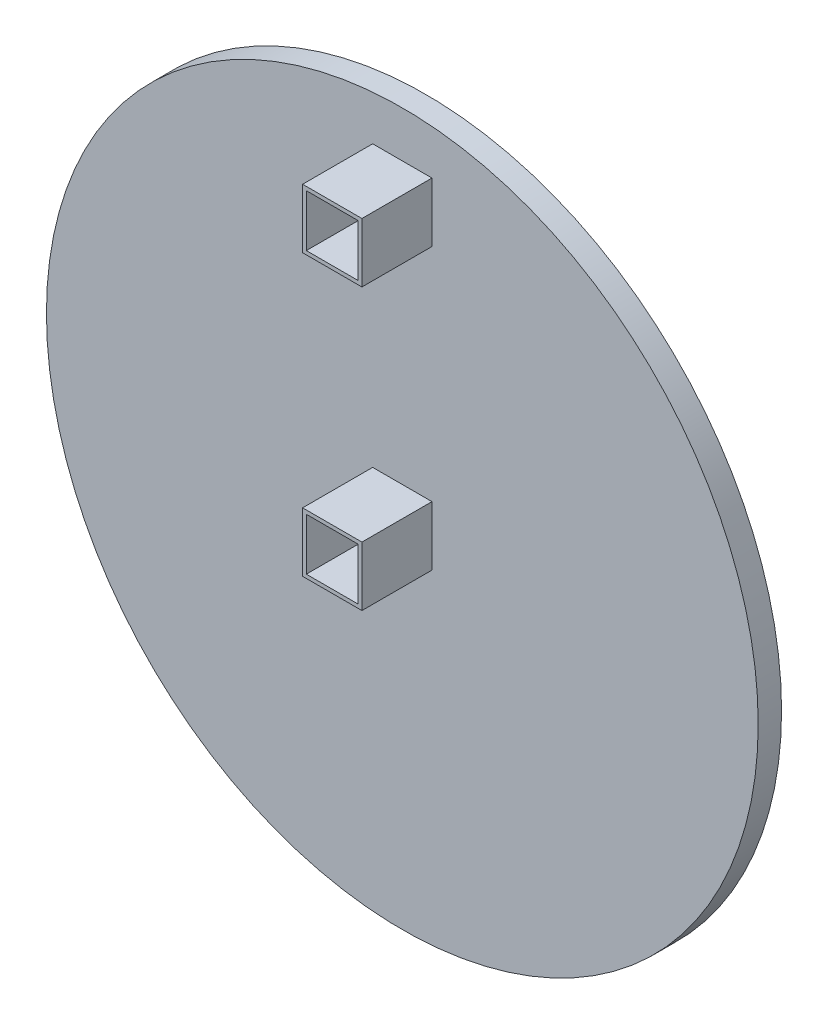
ISO-10303-21;
HEADER;
FILE_DESCRIPTION(('STEP AP214'),'2;1');
FILE_NAME('part.step','',(''),(''),'','','');
FILE_SCHEMA(('AUTOMOTIVE_DESIGN { 1 0 10303 214 1 1 1 1 }'));
ENDSEC;
DATA;
#1=APPLICATION_CONTEXT('core data for automotive mechanical design processes');
#2=APPLICATION_PROTOCOL_DEFINITION('international standard','automotive_design',2000,#1);
#3=PRODUCT_CONTEXT('',#1,'mechanical');
#4=PRODUCT('Part','Part','',(#3));
#5=PRODUCT_RELATED_PRODUCT_CATEGORY('part','',(#4));
#6=PRODUCT_DEFINITION_FORMATION('','',#4);
#7=PRODUCT_DEFINITION_CONTEXT('part definition',#1,'design');
#8=PRODUCT_DEFINITION('design','',#6,#7);
#9=PRODUCT_DEFINITION_SHAPE('','',#8);
#10=(LENGTH_UNIT() NAMED_UNIT(*) SI_UNIT(.MILLI.,.METRE.));
#11=(NAMED_UNIT(*) PLANE_ANGLE_UNIT() SI_UNIT($,.RADIAN.));
#12=(NAMED_UNIT(*) SI_UNIT($,.STERADIAN.) SOLID_ANGLE_UNIT());
#13=UNCERTAINTY_MEASURE_WITH_UNIT(LENGTH_MEASURE(1.E-05),#10,'distance_accuracy_value','');
#14=(GEOMETRIC_REPRESENTATION_CONTEXT(3) GLOBAL_UNCERTAINTY_ASSIGNED_CONTEXT((#13)) GLOBAL_UNIT_ASSIGNED_CONTEXT((#10,
#11,#12)) REPRESENTATION_CONTEXT('',''));
#15=CARTESIAN_POINT('',(0.,0.,0.));
#16=DIRECTION('',(0.,0.,1.));
#17=DIRECTION('',(1.,0.,0.));
#18=AXIS2_PLACEMENT_3D('',#15,#16,#17);
#19=CARTESIAN_POINT('',(0.,0.,10.));
#20=DIRECTION('',(0.,0.,1.));
#21=DIRECTION('',(1.,0.,0.));
#22=AXIS2_PLACEMENT_3D('',#19,#20,#21);
#23=PLANE('',#22);
#24=DIRECTION('',(-1.,0.,0.));
#25=VECTOR('',#24,1.);
#26=CARTESIAN_POINT('',(-12.7,12.7,10.));
#27=LINE('',#26,#25);
#28=CARTESIAN_POINT('',(12.7,12.7,10.));
#29=VERTEX_POINT('',#28);
#30=CARTESIAN_POINT('',(-12.7,12.7,10.));
#31=VERTEX_POINT('',#30);
#32=EDGE_CURVE('E256',#29,#31,#27,.T.);
#33=ORIENTED_EDGE('',*,*,#32,.F.);
#34=DIRECTION('',(0.,1.,0.));
#35=VECTOR('',#34,1.);
#36=CARTESIAN_POINT('',(12.7,12.7,10.));
#37=LINE('',#36,#35);
#38=CARTESIAN_POINT('',(12.7,-12.7,10.));
#39=VERTEX_POINT('',#38);
#40=EDGE_CURVE('E242',#39,#29,#37,.T.);
#41=ORIENTED_EDGE('',*,*,#40,.F.);
#42=DIRECTION('',(1.,0.,0.));
#43=VECTOR('',#42,1.);
#44=CARTESIAN_POINT('',(-12.7,-12.7,10.));
#45=LINE('',#44,#43);
#46=CARTESIAN_POINT('',(-12.7,-12.7,10.));
#47=VERTEX_POINT('',#46);
#48=EDGE_CURVE('E247',#47,#39,#45,.T.);
#49=ORIENTED_EDGE('',*,*,#48,.F.);
#50=DIRECTION('',(0.,-1.,0.));
#51=VECTOR('',#50,1.);
#52=CARTESIAN_POINT('',(-12.7,12.7,10.));
#53=LINE('',#52,#51);
#54=EDGE_CURVE('E258',#31,#47,#53,.T.);
#55=ORIENTED_EDGE('',*,*,#54,.F.);
#56=EDGE_LOOP('',(#33,#41,#49,#55));
#57=FACE_BOUND('',#56,.T.);
#58=CARTESIAN_POINT('',(0.,0.,10.));
#59=DIRECTION('',(0.,0.,1.));
#60=DIRECTION('',(1.,0.,0.));
#61=AXIS2_PLACEMENT_3D('',#58,#59,#60);
#62=CIRCLE('',#61,152.4);
#63=CARTESIAN_POINT('',(152.4,0.,10.));
#64=VERTEX_POINT('',#63);
#65=EDGE_CURVE('E11',#64,#64,#62,.T.);
#66=ORIENTED_EDGE('',*,*,#65,.T.);
#67=EDGE_LOOP('',(#66));
#68=FACE_BOUND('',#67,.T.);
#69=DIRECTION('',(-1.,0.,0.));
#70=VECTOR('',#69,1.);
#71=CARTESIAN_POINT('',(-12.7,132.7,10.));
#72=LINE('',#71,#70);
#73=CARTESIAN_POINT('',(12.7,132.7,10.));
#74=VERTEX_POINT('',#73);
#75=CARTESIAN_POINT('',(-12.7,132.7,10.));
#76=VERTEX_POINT('',#75);
#77=EDGE_CURVE('E200',#74,#76,#72,.T.);
#78=ORIENTED_EDGE('',*,*,#77,.F.);
#79=DIRECTION('',(0.,1.,0.));
#80=VECTOR('',#79,1.);
#81=CARTESIAN_POINT('',(12.7,132.7,10.));
#82=LINE('',#81,#80);
#83=CARTESIAN_POINT('',(12.7,107.3,10.));
#84=VERTEX_POINT('',#83);
#85=EDGE_CURVE('E165',#84,#74,#82,.T.);
#86=ORIENTED_EDGE('',*,*,#85,.F.);
#87=DIRECTION('',(1.,0.,0.));
#88=VECTOR('',#87,1.);
#89=CARTESIAN_POINT('',(-12.7,107.3,10.));
#90=LINE('',#89,#88);
#91=CARTESIAN_POINT('',(-12.7,107.3,10.));
#92=VERTEX_POINT('',#91);
#93=EDGE_CURVE('E191',#92,#84,#90,.T.);
#94=ORIENTED_EDGE('',*,*,#93,.F.);
#95=DIRECTION('',(0.,-1.,0.));
#96=VECTOR('',#95,1.);
#97=CARTESIAN_POINT('',(-12.7,132.7,10.));
#98=LINE('',#97,#96);
#99=EDGE_CURVE('E202',#76,#92,#98,.T.);
#100=ORIENTED_EDGE('',*,*,#99,.F.);
#101=EDGE_LOOP('',(#78,#86,#94,#100));
#102=FACE_BOUND('',#101,.T.);
#103=ADVANCED_FACE('F33',(#57,#68,#102),#23,.T.);
#104=CARTESIAN_POINT('',(0.,0.,10.));
#105=DIRECTION('',(0.,0.,-1.));
#106=DIRECTION('',(-1.,0.,0.));
#107=AXIS2_PLACEMENT_3D('',#104,#105,#106);
#108=CYLINDRICAL_SURFACE('',#107,152.4);
#109=ORIENTED_EDGE('',*,*,#65,.F.);
#110=EDGE_LOOP('',(#109));
#111=FACE_BOUND('',#110,.T.);
#112=CARTESIAN_POINT('',(0.,0.,0.));
#113=DIRECTION('',(0.,0.,1.));
#114=DIRECTION('',(1.,0.,0.));
#115=AXIS2_PLACEMENT_3D('',#112,#113,#114);
#116=CIRCLE('',#115,152.4);
#117=CARTESIAN_POINT('',(152.4,0.,0.));
#118=VERTEX_POINT('',#117);
#119=EDGE_CURVE('E37',#118,#118,#116,.T.);
#120=ORIENTED_EDGE('',*,*,#119,.T.);
#121=EDGE_LOOP('',(#120));
#122=FACE_BOUND('',#121,.T.);
#123=ADVANCED_FACE('F35',(#111,#122),#108,.T.);
#124=CARTESIAN_POINT('',(0.,0.,0.));
#125=DIRECTION('',(0.,0.,1.));
#126=DIRECTION('',(1.,0.,0.));
#127=AXIS2_PLACEMENT_3D('',#124,#125,#126);
#128=PLANE('',#127);
#129=ORIENTED_EDGE('',*,*,#119,.F.);
#130=EDGE_LOOP('',(#129));
#131=FACE_BOUND('',#130,.T.);
#132=ADVANCED_FACE('F276',(#131),#128,.F.);
#133=CARTESIAN_POINT('',(0.,0.,40.));
#134=DIRECTION('',(0.,0.,1.));
#135=DIRECTION('',(1.,0.,0.));
#136=AXIS2_PLACEMENT_3D('',#133,#134,#135);
#137=PLANE('',#136);
#138=DIRECTION('',(0.,1.,0.));
#139=VECTOR('',#138,1.);
#140=CARTESIAN_POINT('',(12.7,12.7,40.));
#141=LINE('',#140,#139);
#142=CARTESIAN_POINT('',(12.7,-12.7,40.));
#143=VERTEX_POINT('',#142);
#144=CARTESIAN_POINT('',(12.7,12.7,40.));
#145=VERTEX_POINT('',#144);
#146=EDGE_CURVE('E243',#143,#145,#141,.T.);
#147=ORIENTED_EDGE('',*,*,#146,.T.);
#148=DIRECTION('',(-1.,0.,0.));
#149=VECTOR('',#148,1.);
#150=CARTESIAN_POINT('',(-12.7,12.7,40.));
#151=LINE('',#150,#149);
#152=CARTESIAN_POINT('',(-12.7,12.7,40.));
#153=VERTEX_POINT('',#152);
#154=EDGE_CURVE('E246',#145,#153,#151,.T.);
#155=ORIENTED_EDGE('',*,*,#154,.T.);
#156=DIRECTION('',(0.,-1.,0.));
#157=VECTOR('',#156,1.);
#158=CARTESIAN_POINT('',(-12.7,12.7,40.));
#159=LINE('',#158,#157);
#160=CARTESIAN_POINT('',(-12.7,-12.7,40.));
#161=VERTEX_POINT('',#160);
#162=EDGE_CURVE('E249',#153,#161,#159,.T.);
#163=ORIENTED_EDGE('',*,*,#162,.T.);
#164=DIRECTION('',(1.,0.,0.));
#165=VECTOR('',#164,1.);
#166=CARTESIAN_POINT('',(-12.7,-12.7,40.));
#167=LINE('',#166,#165);
#168=EDGE_CURVE('E251',#161,#143,#167,.T.);
#169=ORIENTED_EDGE('',*,*,#168,.T.);
#170=EDGE_LOOP('',(#147,#155,#163,#169));
#171=FACE_BOUND('',#170,.T.);
#172=DIRECTION('',(-1.,0.,0.));
#173=VECTOR('',#172,1.);
#174=CARTESIAN_POINT('',(-11.1125,11.1125,40.));
#175=LINE('',#174,#173);
#176=CARTESIAN_POINT('',(11.1125,11.1125,40.));
#177=VERTEX_POINT('',#176);
#178=CARTESIAN_POINT('',(-11.1125,11.1125,40.));
#179=VERTEX_POINT('',#178);
#180=EDGE_CURVE('E216',#177,#179,#175,.T.);
#181=ORIENTED_EDGE('',*,*,#180,.F.);
#182=DIRECTION('',(0.,1.,0.));
#183=VECTOR('',#182,1.);
#184=CARTESIAN_POINT('',(11.1125,11.1125,40.));
#185=LINE('',#184,#183);
#186=CARTESIAN_POINT('',(11.1125,-11.1125,40.));
#187=VERTEX_POINT('',#186);
#188=EDGE_CURVE('E214',#187,#177,#185,.T.);
#189=ORIENTED_EDGE('',*,*,#188,.F.);
#190=DIRECTION('',(1.,0.,0.));
#191=VECTOR('',#190,1.);
#192=CARTESIAN_POINT('',(-11.1125,-11.1125,40.));
#193=LINE('',#192,#191);
#194=CARTESIAN_POINT('',(-11.1125,-11.1125,40.));
#195=VERTEX_POINT('',#194);
#196=EDGE_CURVE('E222',#195,#187,#193,.T.);
#197=ORIENTED_EDGE('',*,*,#196,.F.);
#198=DIRECTION('',(0.,-1.,0.));
#199=VECTOR('',#198,1.);
#200=CARTESIAN_POINT('',(-11.1125,11.1125,40.));
#201=LINE('',#200,#199);
#202=EDGE_CURVE('E219',#179,#195,#201,.T.);
#203=ORIENTED_EDGE('',*,*,#202,.F.);
#204=EDGE_LOOP('',(#181,#189,#197,#203));
#205=FACE_BOUND('',#204,.T.);
#206=ADVANCED_FACE('F278',(#171,#205),#137,.T.);
#207=CARTESIAN_POINT('',(12.7,12.7,40.));
#208=DIRECTION('',(-1.,0.,0.));
#209=DIRECTION('',(0.,-1.,0.));
#210=AXIS2_PLACEMENT_3D('',#207,#208,#209);
#211=PLANE('',#210);
#212=ORIENTED_EDGE('',*,*,#40,.T.);
#213=DIRECTION('',(0.,0.,-1.));
#214=VECTOR('',#213,1.);
#215=CARTESIAN_POINT('',(12.7,12.7,40.));
#216=LINE('',#215,#214);
#217=EDGE_CURVE('E269',#145,#29,#216,.T.);
#218=ORIENTED_EDGE('',*,*,#217,.F.);
#219=ORIENTED_EDGE('',*,*,#146,.F.);
#220=DIRECTION('',(0.,0.,-1.));
#221=VECTOR('',#220,1.);
#222=CARTESIAN_POINT('',(12.7,-12.7,40.));
#223=LINE('',#222,#221);
#224=EDGE_CURVE('E253',#143,#39,#223,.T.);
#225=ORIENTED_EDGE('',*,*,#224,.T.);
#226=EDGE_LOOP('',(#212,#218,#219,#225));
#227=FACE_BOUND('',#226,.T.);
#228=ADVANCED_FACE('F283',(#227),#211,.F.);
#229=CARTESIAN_POINT('',(-12.7,12.7,40.));
#230=DIRECTION('',(0.,-1.,0.));
#231=DIRECTION('',(0.,0.,-1.));
#232=AXIS2_PLACEMENT_3D('',#229,#230,#231);
#233=PLANE('',#232);
#234=ORIENTED_EDGE('',*,*,#32,.T.);
#235=DIRECTION('',(0.,0.,-1.));
#236=VECTOR('',#235,1.);
#237=CARTESIAN_POINT('',(-12.7,12.7,40.));
#238=LINE('',#237,#236);
#239=EDGE_CURVE('E266',#153,#31,#238,.T.);
#240=ORIENTED_EDGE('',*,*,#239,.F.);
#241=ORIENTED_EDGE('',*,*,#154,.F.);
#242=ORIENTED_EDGE('',*,*,#217,.T.);
#243=EDGE_LOOP('',(#234,#240,#241,#242));
#244=FACE_BOUND('',#243,.T.);
#245=ADVANCED_FACE('F346',(#244),#233,.F.);
#246=CARTESIAN_POINT('',(-12.7,12.7,40.));
#247=DIRECTION('',(1.,0.,0.));
#248=DIRECTION('',(0.,0.,-1.));
#249=AXIS2_PLACEMENT_3D('',#246,#247,#248);
#250=PLANE('',#249);
#251=ORIENTED_EDGE('',*,*,#54,.T.);
#252=DIRECTION('',(0.,0.,-1.));
#253=VECTOR('',#252,1.);
#254=CARTESIAN_POINT('',(-12.7,-12.7,40.));
#255=LINE('',#254,#253);
#256=EDGE_CURVE('E264',#161,#47,#255,.T.);
#257=ORIENTED_EDGE('',*,*,#256,.F.);
#258=ORIENTED_EDGE('',*,*,#162,.F.);
#259=ORIENTED_EDGE('',*,*,#239,.T.);
#260=EDGE_LOOP('',(#251,#257,#258,#259));
#261=FACE_BOUND('',#260,.T.);
#262=ADVANCED_FACE('F342',(#261),#250,.F.);
#263=CARTESIAN_POINT('',(-12.7,-12.7,40.));
#264=DIRECTION('',(0.,1.,0.));
#265=DIRECTION('',(0.,0.,1.));
#266=AXIS2_PLACEMENT_3D('',#263,#264,#265);
#267=PLANE('',#266);
#268=ORIENTED_EDGE('',*,*,#48,.T.);
#269=ORIENTED_EDGE('',*,*,#224,.F.);
#270=ORIENTED_EDGE('',*,*,#168,.F.);
#271=ORIENTED_EDGE('',*,*,#256,.T.);
#272=EDGE_LOOP('',(#268,#269,#270,#271));
#273=FACE_BOUND('',#272,.T.);
#274=ADVANCED_FACE('F338',(#273),#267,.F.);
#275=CARTESIAN_POINT('',(11.1125,11.1125,40.));
#276=DIRECTION('',(-1.,0.,0.));
#277=DIRECTION('',(0.,0.,1.));
#278=AXIS2_PLACEMENT_3D('',#275,#276,#277);
#279=PLANE('',#278);
#280=DIRECTION('',(0.,1.,0.));
#281=VECTOR('',#280,1.);
#282=CARTESIAN_POINT('',(11.1125,11.1125,10.));
#283=LINE('',#282,#281);
#284=CARTESIAN_POINT('',(11.1125,-11.1125,10.));
#285=VERTEX_POINT('',#284);
#286=CARTESIAN_POINT('',(11.1125,11.1125,10.));
#287=VERTEX_POINT('',#286);
#288=EDGE_CURVE('E213',#285,#287,#283,.T.);
#289=ORIENTED_EDGE('',*,*,#288,.F.);
#290=DIRECTION('',(0.,0.,-1.));
#291=VECTOR('',#290,1.);
#292=CARTESIAN_POINT('',(11.1125,-11.1125,40.));
#293=LINE('',#292,#291);
#294=EDGE_CURVE('E224',#187,#285,#293,.T.);
#295=ORIENTED_EDGE('',*,*,#294,.F.);
#296=ORIENTED_EDGE('',*,*,#188,.T.);
#297=DIRECTION('',(0.,0.,-1.));
#298=VECTOR('',#297,1.);
#299=CARTESIAN_POINT('',(11.1125,11.1125,40.));
#300=LINE('',#299,#298);
#301=EDGE_CURVE('E239',#177,#287,#300,.T.);
#302=ORIENTED_EDGE('',*,*,#301,.T.);
#303=EDGE_LOOP('',(#289,#295,#296,#302));
#304=FACE_BOUND('',#303,.T.);
#305=ADVANCED_FACE('F323',(#304),#279,.T.);
#306=CARTESIAN_POINT('',(-11.1125,11.1125,40.));
#307=DIRECTION('',(0.,-1.,0.));
#308=DIRECTION('',(0.,0.,-1.));
#309=AXIS2_PLACEMENT_3D('',#306,#307,#308);
#310=PLANE('',#309);
#311=DIRECTION('',(-1.,0.,0.));
#312=VECTOR('',#311,1.);
#313=CARTESIAN_POINT('',(-11.1125,11.1125,10.));
#314=LINE('',#313,#312);
#315=CARTESIAN_POINT('',(-11.1125,11.1125,10.));
#316=VERTEX_POINT('',#315);
#317=EDGE_CURVE('E226',#287,#316,#314,.T.);
#318=ORIENTED_EDGE('',*,*,#317,.F.);
#319=ORIENTED_EDGE('',*,*,#301,.F.);
#320=ORIENTED_EDGE('',*,*,#180,.T.);
#321=DIRECTION('',(0.,0.,-1.));
#322=VECTOR('',#321,1.);
#323=CARTESIAN_POINT('',(-11.1125,11.1125,40.));
#324=LINE('',#323,#322);
#325=EDGE_CURVE('E236',#179,#316,#324,.T.);
#326=ORIENTED_EDGE('',*,*,#325,.T.);
#327=EDGE_LOOP('',(#318,#319,#320,#326));
#328=FACE_BOUND('',#327,.T.);
#329=ADVANCED_FACE('F319',(#328),#310,.T.);
#330=CARTESIAN_POINT('',(-11.1125,11.1125,40.));
#331=DIRECTION('',(1.,0.,0.));
#332=DIRECTION('',(0.,0.,-1.));
#333=AXIS2_PLACEMENT_3D('',#330,#331,#332);
#334=PLANE('',#333);
#335=DIRECTION('',(0.,-1.,0.));
#336=VECTOR('',#335,1.);
#337=CARTESIAN_POINT('',(-11.1125,11.1125,10.));
#338=LINE('',#337,#336);
#339=CARTESIAN_POINT('',(-11.1125,-11.1125,10.));
#340=VERTEX_POINT('',#339);
#341=EDGE_CURVE('E228',#316,#340,#338,.T.);
#342=ORIENTED_EDGE('',*,*,#341,.F.);
#343=ORIENTED_EDGE('',*,*,#325,.F.);
#344=ORIENTED_EDGE('',*,*,#202,.T.);
#345=DIRECTION('',(0.,0.,-1.));
#346=VECTOR('',#345,1.);
#347=CARTESIAN_POINT('',(-11.1125,-11.1125,40.));
#348=LINE('',#347,#346);
#349=EDGE_CURVE('E233',#195,#340,#348,.T.);
#350=ORIENTED_EDGE('',*,*,#349,.T.);
#351=EDGE_LOOP('',(#342,#343,#344,#350));
#352=FACE_BOUND('',#351,.T.);
#353=ADVANCED_FACE('F309',(#352),#334,.T.);
#354=CARTESIAN_POINT('',(-11.1125,-11.1125,40.));
#355=DIRECTION('',(0.,1.,0.));
#356=DIRECTION('',(0.,0.,1.));
#357=AXIS2_PLACEMENT_3D('',#354,#355,#356);
#358=PLANE('',#357);
#359=DIRECTION('',(1.,0.,0.));
#360=VECTOR('',#359,1.);
#361=CARTESIAN_POINT('',(-11.1125,-11.1125,10.));
#362=LINE('',#361,#360);
#363=EDGE_CURVE('E217',#340,#285,#362,.T.);
#364=ORIENTED_EDGE('',*,*,#363,.F.);
#365=ORIENTED_EDGE('',*,*,#349,.F.);
#366=ORIENTED_EDGE('',*,*,#196,.T.);
#367=ORIENTED_EDGE('',*,*,#294,.T.);
#368=EDGE_LOOP('',(#364,#365,#366,#367));
#369=FACE_BOUND('',#368,.T.);
#370=ADVANCED_FACE('F300',(#369),#358,.T.);
#371=ORIENTED_EDGE('',*,*,#288,.T.);
#372=ORIENTED_EDGE('',*,*,#317,.T.);
#373=ORIENTED_EDGE('',*,*,#341,.T.);
#374=ORIENTED_EDGE('',*,*,#363,.T.);
#375=EDGE_LOOP('',(#371,#372,#373,#374));
#376=FACE_BOUND('',#375,.T.);
#377=ADVANCED_FACE('F291',(#376),#23,.T.);
#378=CARTESIAN_POINT('',(0.,0.,40.));
#379=DIRECTION('',(0.,0.,1.));
#380=DIRECTION('',(1.,0.,0.));
#381=AXIS2_PLACEMENT_3D('',#378,#379,#380);
#382=PLANE('',#381);
#383=DIRECTION('',(0.,1.,0.));
#384=VECTOR('',#383,1.);
#385=CARTESIAN_POINT('',(12.7,132.7,40.));
#386=LINE('',#385,#384);
#387=CARTESIAN_POINT('',(12.7,107.3,40.));
#388=VERTEX_POINT('',#387);
#389=CARTESIAN_POINT('',(12.7,132.7,40.));
#390=VERTEX_POINT('',#389);
#391=EDGE_CURVE('E187',#388,#390,#386,.T.);
#392=ORIENTED_EDGE('',*,*,#391,.T.);
#393=DIRECTION('',(-1.,0.,0.));
#394=VECTOR('',#393,1.);
#395=CARTESIAN_POINT('',(-12.7,132.7,40.));
#396=LINE('',#395,#394);
#397=CARTESIAN_POINT('',(-12.7,132.7,40.));
#398=VERTEX_POINT('',#397);
#399=EDGE_CURVE('E190',#390,#398,#396,.T.);
#400=ORIENTED_EDGE('',*,*,#399,.T.);
#401=DIRECTION('',(0.,-1.,0.));
#402=VECTOR('',#401,1.);
#403=CARTESIAN_POINT('',(-12.7,132.7,40.));
#404=LINE('',#403,#402);
#405=CARTESIAN_POINT('',(-12.7,107.3,40.));
#406=VERTEX_POINT('',#405);
#407=EDGE_CURVE('E193',#398,#406,#404,.T.);
#408=ORIENTED_EDGE('',*,*,#407,.T.);
#409=DIRECTION('',(1.,0.,0.));
#410=VECTOR('',#409,1.);
#411=CARTESIAN_POINT('',(-12.7,107.3,40.));
#412=LINE('',#411,#410);
#413=EDGE_CURVE('E195',#406,#388,#412,.T.);
#414=ORIENTED_EDGE('',*,*,#413,.T.);
#415=EDGE_LOOP('',(#392,#400,#408,#414));
#416=FACE_BOUND('',#415,.T.);
#417=DIRECTION('',(-1.,0.,0.));
#418=VECTOR('',#417,1.);
#419=CARTESIAN_POINT('',(-11.1125,131.1125,40.));
#420=LINE('',#419,#418);
#421=CARTESIAN_POINT('',(11.1125,131.1125,40.));
#422=VERTEX_POINT('',#421);
#423=CARTESIAN_POINT('',(-11.1125,131.1125,40.));
#424=VERTEX_POINT('',#423);
#425=EDGE_CURVE('E157',#422,#424,#420,.T.);
#426=ORIENTED_EDGE('',*,*,#425,.F.);
#427=DIRECTION('',(0.,1.,0.));
#428=VECTOR('',#427,1.);
#429=CARTESIAN_POINT('',(11.1125,131.1125,40.));
#430=LINE('',#429,#428);
#431=CARTESIAN_POINT('',(11.1125,108.8875,40.));
#432=VERTEX_POINT('',#431);
#433=EDGE_CURVE('E148',#432,#422,#430,.T.);
#434=ORIENTED_EDGE('',*,*,#433,.F.);
#435=DIRECTION('',(1.,0.,0.));
#436=VECTOR('',#435,1.);
#437=CARTESIAN_POINT('',(-11.1125,108.8875,40.));
#438=LINE('',#437,#436);
#439=CARTESIAN_POINT('',(-11.1125,108.8875,40.));
#440=VERTEX_POINT('',#439);
#441=EDGE_CURVE('E173',#440,#432,#438,.T.);
#442=ORIENTED_EDGE('',*,*,#441,.F.);
#443=DIRECTION('',(0.,-1.,0.));
#444=VECTOR('',#443,1.);
#445=CARTESIAN_POINT('',(-11.1125,131.1125,40.));
#446=LINE('',#445,#444);
#447=EDGE_CURVE('E171',#424,#440,#446,.T.);
#448=ORIENTED_EDGE('',*,*,#447,.F.);
#449=EDGE_LOOP('',(#426,#434,#442,#448));
#450=FACE_BOUND('',#449,.T.);
#451=ADVANCED_FACE('F169',(#416,#450),#382,.T.);
#452=CARTESIAN_POINT('',(12.7,132.7,40.));
#453=DIRECTION('',(-1.,0.,0.));
#454=DIRECTION('',(0.,-1.,0.));
#455=AXIS2_PLACEMENT_3D('',#452,#453,#454);
#456=PLANE('',#455);
#457=ORIENTED_EDGE('',*,*,#85,.T.);
#458=DIRECTION('',(0.,0.,-1.));
#459=VECTOR('',#458,1.);
#460=CARTESIAN_POINT('',(12.7,132.7,40.));
#461=LINE('',#460,#459);
#462=EDGE_CURVE('E211',#390,#74,#461,.T.);
#463=ORIENTED_EDGE('',*,*,#462,.F.);
#464=ORIENTED_EDGE('',*,*,#391,.F.);
#465=DIRECTION('',(0.,0.,-1.));
#466=VECTOR('',#465,1.);
#467=CARTESIAN_POINT('',(12.7,107.3,40.));
#468=LINE('',#467,#466);
#469=EDGE_CURVE('E197',#388,#84,#468,.T.);
#470=ORIENTED_EDGE('',*,*,#469,.T.);
#471=EDGE_LOOP('',(#457,#463,#464,#470));
#472=FACE_BOUND('',#471,.T.);
#473=ADVANCED_FACE('F306',(#472),#456,.F.);
#474=CARTESIAN_POINT('',(-12.7,132.7,40.));
#475=DIRECTION('',(0.,-1.,0.));
#476=DIRECTION('',(0.,0.,-1.));
#477=AXIS2_PLACEMENT_3D('',#474,#475,#476);
#478=PLANE('',#477);
#479=ORIENTED_EDGE('',*,*,#77,.T.);
#480=DIRECTION('',(0.,0.,-1.));
#481=VECTOR('',#480,1.);
#482=CARTESIAN_POINT('',(-12.7,132.7,40.));
#483=LINE('',#482,#481);
#484=EDGE_CURVE('E208',#398,#76,#483,.T.);
#485=ORIENTED_EDGE('',*,*,#484,.F.);
#486=ORIENTED_EDGE('',*,*,#399,.F.);
#487=ORIENTED_EDGE('',*,*,#462,.T.);
#488=EDGE_LOOP('',(#479,#485,#486,#487));
#489=FACE_BOUND('',#488,.T.);
#490=ADVANCED_FACE('F415',(#489),#478,.F.);
#491=CARTESIAN_POINT('',(-12.7,132.7,40.));
#492=DIRECTION('',(1.,0.,0.));
#493=DIRECTION('',(0.,1.,0.));
#494=AXIS2_PLACEMENT_3D('',#491,#492,#493);
#495=PLANE('',#494);
#496=ORIENTED_EDGE('',*,*,#99,.T.);
#497=DIRECTION('',(0.,0.,-1.));
#498=VECTOR('',#497,1.);
#499=CARTESIAN_POINT('',(-12.7,107.3,40.));
#500=LINE('',#499,#498);
#501=EDGE_CURVE('E48',#406,#92,#500,.T.);
#502=ORIENTED_EDGE('',*,*,#501,.F.);
#503=ORIENTED_EDGE('',*,*,#407,.F.);
#504=ORIENTED_EDGE('',*,*,#484,.T.);
#505=EDGE_LOOP('',(#496,#502,#503,#504));
#506=FACE_BOUND('',#505,.T.);
#507=ADVANCED_FACE('F424',(#506),#495,.F.);
#508=CARTESIAN_POINT('',(-12.7,107.3,40.));
#509=DIRECTION('',(0.,1.,0.));
#510=DIRECTION('',(0.,0.,1.));
#511=AXIS2_PLACEMENT_3D('',#508,#509,#510);
#512=PLANE('',#511);
#513=ORIENTED_EDGE('',*,*,#93,.T.);
#514=ORIENTED_EDGE('',*,*,#469,.F.);
#515=ORIENTED_EDGE('',*,*,#413,.F.);
#516=ORIENTED_EDGE('',*,*,#501,.T.);
#517=EDGE_LOOP('',(#513,#514,#515,#516));
#518=FACE_BOUND('',#517,.T.);
#519=ADVANCED_FACE('F434',(#518),#512,.F.);
#520=CARTESIAN_POINT('',(11.1125,131.1125,40.));
#521=DIRECTION('',(-1.,0.,0.));
#522=DIRECTION('',(0.,0.,1.));
#523=AXIS2_PLACEMENT_3D('',#520,#521,#522);
#524=PLANE('',#523);
#525=DIRECTION('',(0.,1.,0.));
#526=VECTOR('',#525,1.);
#527=CARTESIAN_POINT('',(11.1125,131.1125,10.));
#528=LINE('',#527,#526);
#529=CARTESIAN_POINT('',(11.1125,108.8875,10.));
#530=VERTEX_POINT('',#529);
#531=CARTESIAN_POINT('',(11.1125,131.1125,10.));
#532=VERTEX_POINT('',#531);
#533=EDGE_CURVE('E56',#530,#532,#528,.T.);
#534=ORIENTED_EDGE('',*,*,#533,.F.);
#535=DIRECTION('',(0.,0.,-1.));
#536=VECTOR('',#535,1.);
#537=CARTESIAN_POINT('',(11.1125,108.8875,40.));
#538=LINE('',#537,#536);
#539=EDGE_CURVE('E153',#432,#530,#538,.T.);
#540=ORIENTED_EDGE('',*,*,#539,.F.);
#541=ORIENTED_EDGE('',*,*,#433,.T.);
#542=DIRECTION('',(0.,0.,-1.));
#543=VECTOR('',#542,1.);
#544=CARTESIAN_POINT('',(11.1125,131.1125,40.));
#545=LINE('',#544,#543);
#546=EDGE_CURVE('E151',#422,#532,#545,.T.);
#547=ORIENTED_EDGE('',*,*,#546,.T.);
#548=EDGE_LOOP('',(#534,#540,#541,#547));
#549=FACE_BOUND('',#548,.T.);
#550=ADVANCED_FACE('F150',(#549),#524,.T.);
#551=CARTESIAN_POINT('',(-11.1125,131.1125,40.));
#552=DIRECTION('',(0.,-1.,0.));
#553=DIRECTION('',(0.,0.,-1.));
#554=AXIS2_PLACEMENT_3D('',#551,#552,#553);
#555=PLANE('',#554);
#556=DIRECTION('',(-1.,0.,0.));
#557=VECTOR('',#556,1.);
#558=CARTESIAN_POINT('',(-11.1125,131.1125,10.));
#559=LINE('',#558,#557);
#560=CARTESIAN_POINT('',(-11.1125,131.1125,10.));
#561=VERTEX_POINT('',#560);
#562=EDGE_CURVE('E164',#532,#561,#559,.T.);
#563=ORIENTED_EDGE('',*,*,#562,.F.);
#564=ORIENTED_EDGE('',*,*,#546,.F.);
#565=ORIENTED_EDGE('',*,*,#425,.T.);
#566=DIRECTION('',(0.,0.,-1.));
#567=VECTOR('',#566,1.);
#568=CARTESIAN_POINT('',(-11.1125,131.1125,40.));
#569=LINE('',#568,#567);
#570=EDGE_CURVE('E166',#424,#561,#569,.T.);
#571=ORIENTED_EDGE('',*,*,#570,.T.);
#572=EDGE_LOOP('',(#563,#564,#565,#571));
#573=FACE_BOUND('',#572,.T.);
#574=ADVANCED_FACE('F161',(#573),#555,.T.);
#575=CARTESIAN_POINT('',(-11.1125,131.1125,40.));
#576=DIRECTION('',(1.,0.,0.));
#577=DIRECTION('',(0.,0.,-1.));
#578=AXIS2_PLACEMENT_3D('',#575,#576,#577);
#579=PLANE('',#578);
#580=DIRECTION('',(0.,-1.,0.));
#581=VECTOR('',#580,1.);
#582=CARTESIAN_POINT('',(-11.1125,131.1125,10.));
#583=LINE('',#582,#581);
#584=CARTESIAN_POINT('',(-11.1125,108.8875,10.));
#585=VERTEX_POINT('',#584);
#586=EDGE_CURVE('E179',#561,#585,#583,.T.);
#587=ORIENTED_EDGE('',*,*,#586,.F.);
#588=ORIENTED_EDGE('',*,*,#570,.F.);
#589=ORIENTED_EDGE('',*,*,#447,.T.);
#590=DIRECTION('',(0.,0.,-1.));
#591=VECTOR('',#590,1.);
#592=CARTESIAN_POINT('',(-11.1125,108.8875,40.));
#593=LINE('',#592,#591);
#594=EDGE_CURVE('E183',#440,#585,#593,.T.);
#595=ORIENTED_EDGE('',*,*,#594,.T.);
#596=EDGE_LOOP('',(#587,#588,#589,#595));
#597=FACE_BOUND('',#596,.T.);
#598=ADVANCED_FACE('F460',(#597),#579,.T.);
#599=CARTESIAN_POINT('',(-11.1125,108.8875,40.));
#600=DIRECTION('',(0.,1.,0.));
#601=DIRECTION('',(0.,0.,1.));
#602=AXIS2_PLACEMENT_3D('',#599,#600,#601);
#603=PLANE('',#602);
#604=DIRECTION('',(1.,0.,0.));
#605=VECTOR('',#604,1.);
#606=CARTESIAN_POINT('',(-11.1125,108.8875,10.));
#607=LINE('',#606,#605);
#608=EDGE_CURVE('E158',#585,#530,#607,.T.);
#609=ORIENTED_EDGE('',*,*,#608,.F.);
#610=ORIENTED_EDGE('',*,*,#594,.F.);
#611=ORIENTED_EDGE('',*,*,#441,.T.);
#612=ORIENTED_EDGE('',*,*,#539,.T.);
#613=EDGE_LOOP('',(#609,#610,#611,#612));
#614=FACE_BOUND('',#613,.T.);
#615=ADVANCED_FACE('F298',(#614),#603,.T.);
#616=ORIENTED_EDGE('',*,*,#533,.T.);
#617=ORIENTED_EDGE('',*,*,#562,.T.);
#618=ORIENTED_EDGE('',*,*,#586,.T.);
#619=ORIENTED_EDGE('',*,*,#608,.T.);
#620=EDGE_LOOP('',(#616,#617,#618,#619));
#621=FACE_BOUND('',#620,.T.);
#622=ADVANCED_FACE('F290',(#621),#23,.T.);
#623=CLOSED_SHELL('',(#103,#123,#132,#206,#228,#245,#262,#274,#305,#329,#353,#370,#377,#451,
#473,#490,#507,#519,#550,#574,#598,#615,#622));
#624=MANIFOLD_SOLID_BREP('B2',#623);
#625=ADVANCED_BREP_SHAPE_REPRESENTATION('',(#18,#624),#14);
#626=SHAPE_DEFINITION_REPRESENTATION(#9,#625);
ENDSEC;
END-ISO-10303-21;
